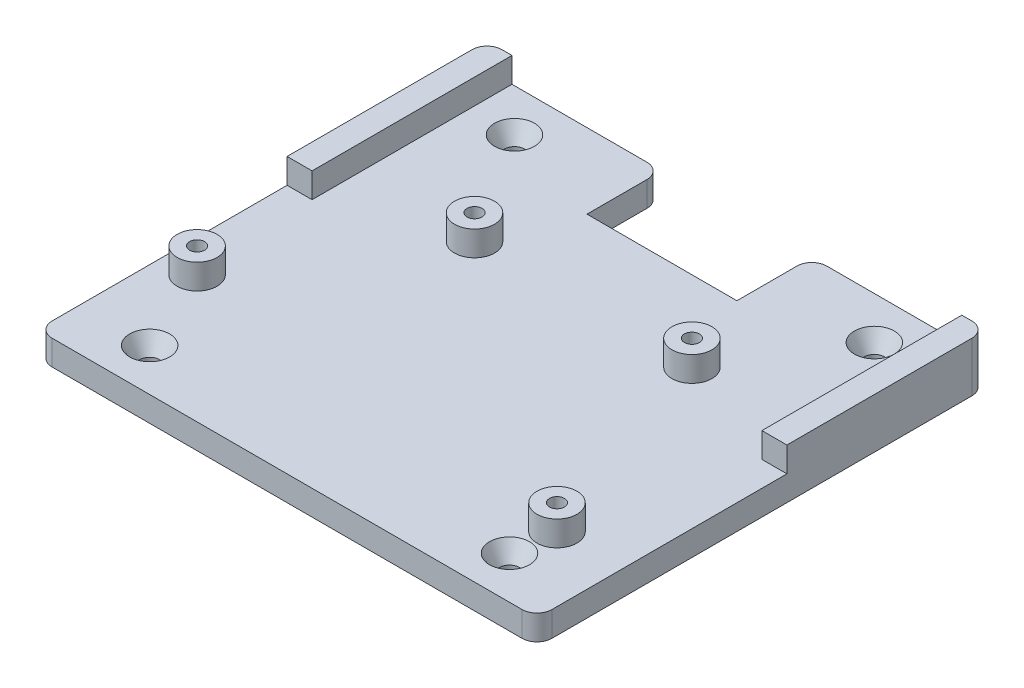
ISO-10303-21;
HEADER;
FILE_DESCRIPTION(('STEP AP214'),'2;1');
FILE_NAME('part.step','',(''),(''),'','','');
FILE_SCHEMA(('AUTOMOTIVE_DESIGN { 1 0 10303 214 1 1 1 1 }'));
ENDSEC;
DATA;
#1=APPLICATION_CONTEXT('core data for automotive mechanical design processes');
#2=APPLICATION_PROTOCOL_DEFINITION('international standard','automotive_design',2000,#1);
#3=PRODUCT_CONTEXT('',#1,'mechanical');
#4=PRODUCT('Part','Part','',(#3));
#5=PRODUCT_RELATED_PRODUCT_CATEGORY('part','',(#4));
#6=PRODUCT_DEFINITION_FORMATION('','',#4);
#7=PRODUCT_DEFINITION_CONTEXT('part definition',#1,'design');
#8=PRODUCT_DEFINITION('design','',#6,#7);
#9=PRODUCT_DEFINITION_SHAPE('','',#8);
#10=(LENGTH_UNIT() NAMED_UNIT(*) SI_UNIT(.MILLI.,.METRE.));
#11=(NAMED_UNIT(*) PLANE_ANGLE_UNIT() SI_UNIT($,.RADIAN.));
#12=(NAMED_UNIT(*) SI_UNIT($,.STERADIAN.) SOLID_ANGLE_UNIT());
#13=UNCERTAINTY_MEASURE_WITH_UNIT(LENGTH_MEASURE(1.E-05),#10,'distance_accuracy_value','');
#14=(GEOMETRIC_REPRESENTATION_CONTEXT(3) GLOBAL_UNCERTAINTY_ASSIGNED_CONTEXT((#13)) GLOBAL_UNIT_ASSIGNED_CONTEXT((#10,
#11,#12)) REPRESENTATION_CONTEXT('',''));
#15=CARTESIAN_POINT('',(0.,0.,0.));
#16=DIRECTION('',(0.,0.,1.));
#17=DIRECTION('',(1.,0.,0.));
#18=AXIS2_PLACEMENT_3D('',#15,#16,#17);
#19=CARTESIAN_POINT('',(0.,5.,0.));
#20=DIRECTION('',(0.,1.,0.));
#21=DIRECTION('',(0.,0.,1.));
#22=AXIS2_PLACEMENT_3D('',#19,#20,#21);
#23=PLANE('',#22);
#24=CARTESIAN_POINT('',(-21.5,5.,-14.));
#25=DIRECTION('',(0.,1.,0.));
#26=DIRECTION('',(0.,0.,1.));
#27=AXIS2_PLACEMENT_3D('',#24,#25,#26);
#28=CIRCLE('',#27,4.);
#29=CARTESIAN_POINT('',(-21.5,5.,-10.));
#30=VERTEX_POINT('',#29);
#31=EDGE_CURVE('E235',#30,#30,#28,.T.);
#32=ORIENTED_EDGE('',*,*,#31,.F.);
#33=EDGE_LOOP('',(#32));
#34=FACE_BOUND('',#33,.T.);
#35=CARTESIAN_POINT('',(22.,5.,-14.));
#36=DIRECTION('',(0.,1.,0.));
#37=DIRECTION('',(0.,0.,1.));
#38=AXIS2_PLACEMENT_3D('',#35,#36,#37);
#39=CIRCLE('',#38,4.);
#40=CARTESIAN_POINT('',(22.,5.,-10.));
#41=VERTEX_POINT('',#40);
#42=EDGE_CURVE('E244',#41,#41,#39,.T.);
#43=ORIENTED_EDGE('',*,*,#42,.F.);
#44=EDGE_LOOP('',(#43));
#45=FACE_BOUND('',#44,.T.);
#46=CARTESIAN_POINT('',(37.,5.,28.));
#47=DIRECTION('',(0.,1.,0.));
#48=DIRECTION('',(0.,0.,1.));
#49=AXIS2_PLACEMENT_3D('',#46,#47,#48);
#50=CIRCLE('',#49,4.);
#51=CARTESIAN_POINT('',(37.,5.,32.));
#52=VERTEX_POINT('',#51);
#53=EDGE_CURVE('E253',#52,#52,#50,.T.);
#54=ORIENTED_EDGE('',*,*,#53,.F.);
#55=EDGE_LOOP('',(#54));
#56=FACE_BOUND('',#55,.T.);
#57=CARTESIAN_POINT('',(-43.5,5.,19.5));
#58=DIRECTION('',(0.,1.,0.));
#59=DIRECTION('',(0.,0.,1.));
#60=AXIS2_PLACEMENT_3D('',#57,#58,#59);
#61=CIRCLE('',#60,4.00000000000001);
#62=CARTESIAN_POINT('',(-43.5,5.,23.5));
#63=VERTEX_POINT('',#62);
#64=EDGE_CURVE('E269',#63,#63,#61,.T.);
#65=ORIENTED_EDGE('',*,*,#64,.F.);
#66=EDGE_LOOP('',(#65));
#67=FACE_BOUND('',#66,.T.);
#68=CARTESIAN_POINT('',(-36.,5.,36.5));
#69=DIRECTION('',(0.,1.,0.));
#70=DIRECTION('',(0.,0.,1.));
#71=AXIS2_PLACEMENT_3D('',#68,#69,#70);
#72=CIRCLE('',#71,4.);
#73=CARTESIAN_POINT('',(-36.,5.,40.5));
#74=VERTEX_POINT('',#73);
#75=EDGE_CURVE('E344',#74,#74,#72,.F.);
#76=ORIENTED_EDGE('',*,*,#75,.T.);
#77=EDGE_LOOP('',(#76));
#78=FACE_BOUND('',#77,.T.);
#79=CARTESIAN_POINT('',(36.,5.,36.5));
#80=DIRECTION('',(0.,1.,0.));
#81=DIRECTION('',(0.,0.,1.));
#82=AXIS2_PLACEMENT_3D('',#79,#80,#81);
#83=CIRCLE('',#82,4.);
#84=CARTESIAN_POINT('',(36.,5.,40.5));
#85=VERTEX_POINT('',#84);
#86=EDGE_CURVE('E341',#85,#85,#83,.F.);
#87=ORIENTED_EDGE('',*,*,#86,.T.);
#88=EDGE_LOOP('',(#87));
#89=FACE_BOUND('',#88,.T.);
#90=CARTESIAN_POINT('',(36.,5.,-36.5));
#91=DIRECTION('',(0.,1.,0.));
#92=DIRECTION('',(0.,0.,1.));
#93=AXIS2_PLACEMENT_3D('',#90,#91,#92);
#94=CIRCLE('',#93,3.99999999999995);
#95=CARTESIAN_POINT('',(36.,5.,-32.5));
#96=VERTEX_POINT('',#95);
#97=EDGE_CURVE('E338',#96,#96,#94,.F.);
#98=ORIENTED_EDGE('',*,*,#97,.T.);
#99=EDGE_LOOP('',(#98));
#100=FACE_BOUND('',#99,.T.);
#101=CARTESIAN_POINT('',(-36.,5.,-36.5));
#102=DIRECTION('',(0.,1.,0.));
#103=DIRECTION('',(0.,0.,1.));
#104=AXIS2_PLACEMENT_3D('',#101,#102,#103);
#105=CIRCLE('',#104,3.99999999999995);
#106=CARTESIAN_POINT('',(-36.,5.,-32.5));
#107=VERTEX_POINT('',#106);
#108=EDGE_CURVE('E335',#107,#107,#105,.F.);
#109=ORIENTED_EDGE('',*,*,#108,.T.);
#110=EDGE_LOOP('',(#109));
#111=FACE_BOUND('',#110,.T.);
#112=DIRECTION('',(0.,0.,-1.));
#113=VECTOR('',#112,1.);
#114=CARTESIAN_POINT('',(-15.,5.,-45.));
#115=LINE('',#114,#113);
#116=CARTESIAN_POINT('',(-15.,5.,-30.));
#117=VERTEX_POINT('',#116);
#118=CARTESIAN_POINT('',(-15.,5.,-42.));
#119=VERTEX_POINT('',#118);
#120=EDGE_CURVE('E296',#117,#119,#115,.T.);
#121=ORIENTED_EDGE('',*,*,#120,.T.);
#122=CARTESIAN_POINT('',(-18.,5.,-42.));
#123=DIRECTION('',(0.,1.,0.));
#124=DIRECTION('',(0.,0.,1.));
#125=AXIS2_PLACEMENT_3D('',#122,#123,#124);
#126=CIRCLE('',#125,3.);
#127=CARTESIAN_POINT('',(-18.,5.,-45.));
#128=VERTEX_POINT('',#127);
#129=EDGE_CURVE('E388',#119,#128,#126,.T.);
#130=ORIENTED_EDGE('',*,*,#129,.T.);
#131=DIRECTION('',(-1.,0.,0.));
#132=VECTOR('',#131,1.);
#133=CARTESIAN_POINT('',(-50.,5.,-45.));
#134=LINE('',#133,#132);
#135=CARTESIAN_POINT('',(-45.,5.,-45.));
#136=VERTEX_POINT('',#135);
#137=EDGE_CURVE('E299',#128,#136,#134,.T.);
#138=ORIENTED_EDGE('',*,*,#137,.T.);
#139=DIRECTION('',(0.,0.,-1.));
#140=VECTOR('',#139,1.);
#141=CARTESIAN_POINT('',(-45.,5.,-45.));
#142=LINE('',#141,#140);
#143=CARTESIAN_POINT('',(-45.,5.,-5.));
#144=VERTEX_POINT('',#143);
#145=EDGE_CURVE('E211',#144,#136,#142,.T.);
#146=ORIENTED_EDGE('',*,*,#145,.F.);
#147=DIRECTION('',(1.,0.,0.));
#148=VECTOR('',#147,1.);
#149=CARTESIAN_POINT('',(-50.,5.,-5.));
#150=LINE('',#149,#148);
#151=CARTESIAN_POINT('',(-50.,5.,-5.));
#152=VERTEX_POINT('',#151);
#153=EDGE_CURVE('E201',#152,#144,#150,.T.);
#154=ORIENTED_EDGE('',*,*,#153,.F.);
#155=DIRECTION('',(0.,0.,1.));
#156=VECTOR('',#155,1.);
#157=CARTESIAN_POINT('',(-50.,5.,-45.));
#158=LINE('',#157,#156);
#159=CARTESIAN_POINT('',(-50.,5.,42.));
#160=VERTEX_POINT('',#159);
#161=EDGE_CURVE('E301',#152,#160,#158,.T.);
#162=ORIENTED_EDGE('',*,*,#161,.T.);
#163=CARTESIAN_POINT('',(-47.,5.,42.));
#164=DIRECTION('',(0.,1.,0.));
#165=DIRECTION('',(0.,0.,1.));
#166=AXIS2_PLACEMENT_3D('',#163,#164,#165);
#167=CIRCLE('',#166,3.);
#168=CARTESIAN_POINT('',(-47.,5.,45.));
#169=VERTEX_POINT('',#168);
#170=EDGE_CURVE('E382',#160,#169,#167,.T.);
#171=ORIENTED_EDGE('',*,*,#170,.T.);
#172=DIRECTION('',(1.,0.,0.));
#173=VECTOR('',#172,1.);
#174=CARTESIAN_POINT('',(-50.,5.,45.));
#175=LINE('',#174,#173);
#176=CARTESIAN_POINT('',(47.,5.,45.));
#177=VERTEX_POINT('',#176);
#178=EDGE_CURVE('E304',#169,#177,#175,.T.);
#179=ORIENTED_EDGE('',*,*,#178,.T.);
#180=CARTESIAN_POINT('',(47.,5.,42.));
#181=DIRECTION('',(0.,1.,0.));
#182=DIRECTION('',(0.,0.,1.));
#183=AXIS2_PLACEMENT_3D('',#180,#181,#182);
#184=CIRCLE('',#183,3.);
#185=CARTESIAN_POINT('',(50.,5.,42.));
#186=VERTEX_POINT('',#185);
#187=EDGE_CURVE('E384',#177,#186,#184,.T.);
#188=ORIENTED_EDGE('',*,*,#187,.T.);
#189=DIRECTION('',(0.,0.,-1.));
#190=VECTOR('',#189,1.);
#191=CARTESIAN_POINT('',(50.,5.,-45.));
#192=LINE('',#191,#190);
#193=CARTESIAN_POINT('',(50.,5.,-5.00000000000001));
#194=VERTEX_POINT('',#193);
#195=EDGE_CURVE('E286',#186,#194,#192,.T.);
#196=ORIENTED_EDGE('',*,*,#195,.T.);
#197=DIRECTION('',(1.,0.,0.));
#198=VECTOR('',#197,1.);
#199=CARTESIAN_POINT('',(50.,5.,-5.));
#200=LINE('',#199,#198);
#201=CARTESIAN_POINT('',(45.,5.,-5.));
#202=VERTEX_POINT('',#201);
#203=EDGE_CURVE('E185',#202,#194,#200,.T.);
#204=ORIENTED_EDGE('',*,*,#203,.F.);
#205=DIRECTION('',(0.,0.,1.));
#206=VECTOR('',#205,1.);
#207=CARTESIAN_POINT('',(45.,5.,-45.));
#208=LINE('',#207,#206);
#209=CARTESIAN_POINT('',(45.,5.,-45.));
#210=VERTEX_POINT('',#209);
#211=EDGE_CURVE('E182',#210,#202,#208,.T.);
#212=ORIENTED_EDGE('',*,*,#211,.F.);
#213=DIRECTION('',(-1.,0.,0.));
#214=VECTOR('',#213,1.);
#215=CARTESIAN_POINT('',(15.,5.,-45.));
#216=LINE('',#215,#214);
#217=CARTESIAN_POINT('',(18.,5.,-45.));
#218=VERTEX_POINT('',#217);
#219=EDGE_CURVE('E288',#210,#218,#216,.T.);
#220=ORIENTED_EDGE('',*,*,#219,.T.);
#221=CARTESIAN_POINT('',(18.,5.,-42.));
#222=DIRECTION('',(0.,1.,0.));
#223=DIRECTION('',(0.,0.,1.));
#224=AXIS2_PLACEMENT_3D('',#221,#222,#223);
#225=CIRCLE('',#224,3.);
#226=CARTESIAN_POINT('',(15.,5.,-42.));
#227=VERTEX_POINT('',#226);
#228=EDGE_CURVE('E386',#218,#227,#225,.T.);
#229=ORIENTED_EDGE('',*,*,#228,.T.);
#230=DIRECTION('',(0.,0.,1.));
#231=VECTOR('',#230,1.);
#232=CARTESIAN_POINT('',(15.,5.,-30.));
#233=LINE('',#232,#231);
#234=CARTESIAN_POINT('',(15.,5.,-30.));
#235=VERTEX_POINT('',#234);
#236=EDGE_CURVE('E292',#227,#235,#233,.T.);
#237=ORIENTED_EDGE('',*,*,#236,.T.);
#238=DIRECTION('',(-1.,0.,0.));
#239=VECTOR('',#238,1.);
#240=CARTESIAN_POINT('',(-15.,5.,-30.));
#241=LINE('',#240,#239);
#242=EDGE_CURVE('E294',#235,#117,#241,.T.);
#243=ORIENTED_EDGE('',*,*,#242,.T.);
#244=EDGE_LOOP('',(#121,#130,#138,#146,#154,#162,#171,#179,#188,#196,#204,#212,#220,#229,#237,#243));
#245=FACE_BOUND('',#244,.T.);
#246=ADVANCED_FACE('F35',(#34,#45,#56,#67,#78,#89,#100,#111,#245),#23,.T.);
#247=CARTESIAN_POINT('',(0.,0.,0.));
#248=DIRECTION('',(0.,1.,0.));
#249=DIRECTION('',(0.,0.,1.));
#250=AXIS2_PLACEMENT_3D('',#247,#248,#249);
#251=PLANE('',#250);
#252=DIRECTION('',(-1.,0.,0.));
#253=VECTOR('',#252,1.);
#254=CARTESIAN_POINT('',(-50.,0.,-45.));
#255=LINE('',#254,#253);
#256=CARTESIAN_POINT('',(-18.,0.,-45.));
#257=VERTEX_POINT('',#256);
#258=CARTESIAN_POINT('',(-47.,0.,-45.));
#259=VERTEX_POINT('',#258);
#260=EDGE_CURVE('E319',#257,#259,#255,.T.);
#261=ORIENTED_EDGE('',*,*,#260,.F.);
#262=CARTESIAN_POINT('',(-18.,0.,-42.));
#263=DIRECTION('',(0.,1.,0.));
#264=DIRECTION('',(0.,0.,1.));
#265=AXIS2_PLACEMENT_3D('',#262,#263,#264);
#266=CIRCLE('',#265,3.);
#267=CARTESIAN_POINT('',(-15.,0.,-42.));
#268=VERTEX_POINT('',#267);
#269=EDGE_CURVE('E378',#257,#268,#266,.F.);
#270=ORIENTED_EDGE('',*,*,#269,.T.);
#271=DIRECTION('',(0.,0.,-1.));
#272=VECTOR('',#271,1.);
#273=CARTESIAN_POINT('',(-15.,0.,-45.));
#274=LINE('',#273,#272);
#275=CARTESIAN_POINT('',(-15.,0.,-30.));
#276=VERTEX_POINT('',#275);
#277=EDGE_CURVE('E316',#276,#268,#274,.T.);
#278=ORIENTED_EDGE('',*,*,#277,.F.);
#279=DIRECTION('',(-1.,0.,0.));
#280=VECTOR('',#279,1.);
#281=CARTESIAN_POINT('',(-15.,0.,-30.));
#282=LINE('',#281,#280);
#283=CARTESIAN_POINT('',(15.,0.,-30.));
#284=VERTEX_POINT('',#283);
#285=EDGE_CURVE('E314',#284,#276,#282,.T.);
#286=ORIENTED_EDGE('',*,*,#285,.F.);
#287=DIRECTION('',(0.,0.,1.));
#288=VECTOR('',#287,1.);
#289=CARTESIAN_POINT('',(15.,0.,-30.));
#290=LINE('',#289,#288);
#291=CARTESIAN_POINT('',(15.,0.,-42.));
#292=VERTEX_POINT('',#291);
#293=EDGE_CURVE('E312',#292,#284,#290,.T.);
#294=ORIENTED_EDGE('',*,*,#293,.F.);
#295=CARTESIAN_POINT('',(18.,0.,-42.));
#296=DIRECTION('',(0.,1.,0.));
#297=DIRECTION('',(0.,0.,1.));
#298=AXIS2_PLACEMENT_3D('',#295,#296,#297);
#299=CIRCLE('',#298,3.);
#300=CARTESIAN_POINT('',(18.,0.,-45.));
#301=VERTEX_POINT('',#300);
#302=EDGE_CURVE('E376',#292,#301,#299,.F.);
#303=ORIENTED_EDGE('',*,*,#302,.T.);
#304=DIRECTION('',(-1.,0.,0.));
#305=VECTOR('',#304,1.);
#306=CARTESIAN_POINT('',(15.,0.,-45.));
#307=LINE('',#306,#305);
#308=CARTESIAN_POINT('',(47.,0.,-45.));
#309=VERTEX_POINT('',#308);
#310=EDGE_CURVE('E309',#309,#301,#307,.T.);
#311=ORIENTED_EDGE('',*,*,#310,.F.);
#312=CARTESIAN_POINT('',(47.,0.,-42.));
#313=DIRECTION('',(0.,1.,0.));
#314=DIRECTION('',(0.,0.,1.));
#315=AXIS2_PLACEMENT_3D('',#312,#313,#314);
#316=CIRCLE('',#315,3.);
#317=CARTESIAN_POINT('',(50.,0.,-42.));
#318=VERTEX_POINT('',#317);
#319=EDGE_CURVE('E372',#309,#318,#316,.F.);
#320=ORIENTED_EDGE('',*,*,#319,.T.);
#321=DIRECTION('',(0.,0.,-1.));
#322=VECTOR('',#321,1.);
#323=CARTESIAN_POINT('',(50.,0.,-45.));
#324=LINE('',#323,#322);
#325=CARTESIAN_POINT('',(50.,0.,42.));
#326=VERTEX_POINT('',#325);
#327=EDGE_CURVE('E285',#326,#318,#324,.T.);
#328=ORIENTED_EDGE('',*,*,#327,.F.);
#329=CARTESIAN_POINT('',(47.,0.,42.));
#330=DIRECTION('',(0.,1.,0.));
#331=DIRECTION('',(0.,0.,1.));
#332=AXIS2_PLACEMENT_3D('',#329,#330,#331);
#333=CIRCLE('',#332,3.);
#334=CARTESIAN_POINT('',(47.,0.,45.));
#335=VERTEX_POINT('',#334);
#336=EDGE_CURVE('E374',#326,#335,#333,.F.);
#337=ORIENTED_EDGE('',*,*,#336,.T.);
#338=DIRECTION('',(1.,0.,0.));
#339=VECTOR('',#338,1.);
#340=CARTESIAN_POINT('',(-50.,0.,45.));
#341=LINE('',#340,#339);
#342=CARTESIAN_POINT('',(-47.,0.,45.));
#343=VERTEX_POINT('',#342);
#344=EDGE_CURVE('E289',#343,#335,#341,.T.);
#345=ORIENTED_EDGE('',*,*,#344,.F.);
#346=CARTESIAN_POINT('',(-47.,0.,42.));
#347=DIRECTION('',(0.,1.,0.));
#348=DIRECTION('',(0.,0.,1.));
#349=AXIS2_PLACEMENT_3D('',#346,#347,#348);
#350=CIRCLE('',#349,3.);
#351=CARTESIAN_POINT('',(-50.,0.,42.));
#352=VERTEX_POINT('',#351);
#353=EDGE_CURVE('E368',#343,#352,#350,.F.);
#354=ORIENTED_EDGE('',*,*,#353,.T.);
#355=DIRECTION('',(0.,0.,1.));
#356=VECTOR('',#355,1.);
#357=CARTESIAN_POINT('',(-50.,0.,-45.));
#358=LINE('',#357,#356);
#359=CARTESIAN_POINT('',(-50.,0.,-42.));
#360=VERTEX_POINT('',#359);
#361=EDGE_CURVE('E322',#360,#352,#358,.T.);
#362=ORIENTED_EDGE('',*,*,#361,.F.);
#363=CARTESIAN_POINT('',(-47.,0.,-42.));
#364=DIRECTION('',(0.,1.,0.));
#365=DIRECTION('',(0.,0.,1.));
#366=AXIS2_PLACEMENT_3D('',#363,#364,#365);
#367=CIRCLE('',#366,3.);
#368=EDGE_CURVE('E370',#360,#259,#367,.F.);
#369=ORIENTED_EDGE('',*,*,#368,.T.);
#370=EDGE_LOOP('',(#261,#270,#278,#286,#294,#303,#311,#320,#328,#337,#345,#354,#362,#369));
#371=FACE_BOUND('',#370,.T.);
#372=CARTESIAN_POINT('',(-36.,0.,36.5));
#373=DIRECTION('',(0.,1.,0.));
#374=DIRECTION('',(0.,0.,1.));
#375=AXIS2_PLACEMENT_3D('',#372,#373,#374);
#376=CIRCLE('',#375,2.);
#377=CARTESIAN_POINT('',(-36.,0.,38.5));
#378=VERTEX_POINT('',#377);
#379=EDGE_CURVE('E282',#378,#378,#376,.T.);
#380=ORIENTED_EDGE('',*,*,#379,.T.);
#381=EDGE_LOOP('',(#380));
#382=FACE_BOUND('',#381,.T.);
#383=CARTESIAN_POINT('',(-36.,0.,-36.5));
#384=DIRECTION('',(0.,1.,0.));
#385=DIRECTION('',(0.,0.,1.));
#386=AXIS2_PLACEMENT_3D('',#383,#384,#385);
#387=CIRCLE('',#386,2.);
#388=CARTESIAN_POINT('',(-36.,0.,-34.5));
#389=VERTEX_POINT('',#388);
#390=EDGE_CURVE('E279',#389,#389,#387,.T.);
#391=ORIENTED_EDGE('',*,*,#390,.T.);
#392=EDGE_LOOP('',(#391));
#393=FACE_BOUND('',#392,.T.);
#394=CARTESIAN_POINT('',(36.,0.,-36.5));
#395=DIRECTION('',(0.,1.,0.));
#396=DIRECTION('',(0.,0.,1.));
#397=AXIS2_PLACEMENT_3D('',#394,#395,#396);
#398=CIRCLE('',#397,2.);
#399=CARTESIAN_POINT('',(36.,0.,-34.5));
#400=VERTEX_POINT('',#399);
#401=EDGE_CURVE('E276',#400,#400,#398,.T.);
#402=ORIENTED_EDGE('',*,*,#401,.T.);
#403=EDGE_LOOP('',(#402));
#404=FACE_BOUND('',#403,.T.);
#405=CARTESIAN_POINT('',(36.,0.,36.5));
#406=DIRECTION('',(0.,1.,0.));
#407=DIRECTION('',(0.,0.,1.));
#408=AXIS2_PLACEMENT_3D('',#405,#406,#407);
#409=CIRCLE('',#408,2.);
#410=CARTESIAN_POINT('',(36.,0.,38.5));
#411=VERTEX_POINT('',#410);
#412=EDGE_CURVE('E268',#411,#411,#409,.T.);
#413=ORIENTED_EDGE('',*,*,#412,.T.);
#414=EDGE_LOOP('',(#413));
#415=FACE_BOUND('',#414,.T.);
#416=ADVANCED_FACE('F420',(#371,#382,#393,#404,#415),#251,.F.);
#417=CARTESIAN_POINT('',(50.,5.,-45.));
#418=DIRECTION('',(-1.,0.,0.));
#419=DIRECTION('',(0.,0.,1.));
#420=AXIS2_PLACEMENT_3D('',#417,#418,#419);
#421=PLANE('',#420);
#422=ORIENTED_EDGE('',*,*,#195,.F.);
#423=DIRECTION('',(0.,-1.,0.));
#424=VECTOR('',#423,1.);
#425=CARTESIAN_POINT('',(50.,5.,42.));
#426=LINE('',#425,#424);
#427=EDGE_CURVE('E399',#186,#326,#426,.T.);
#428=ORIENTED_EDGE('',*,*,#427,.T.);
#429=ORIENTED_EDGE('',*,*,#327,.T.);
#430=DIRECTION('',(0.,-1.,0.));
#431=VECTOR('',#430,1.);
#432=CARTESIAN_POINT('',(50.,5.,-42.));
#433=LINE('',#432,#431);
#434=CARTESIAN_POINT('',(50.,10.,-42.));
#435=VERTEX_POINT('',#434);
#436=EDGE_CURVE('E56',#318,#435,#433,.F.);
#437=ORIENTED_EDGE('',*,*,#436,.T.);
#438=DIRECTION('',(0.,0.,-1.));
#439=VECTOR('',#438,1.);
#440=CARTESIAN_POINT('',(50.,10.,-45.));
#441=LINE('',#440,#439);
#442=CARTESIAN_POINT('',(50.,10.,-5.));
#443=VERTEX_POINT('',#442);
#444=EDGE_CURVE('E193',#443,#435,#441,.T.);
#445=ORIENTED_EDGE('',*,*,#444,.F.);
#446=DIRECTION('',(0.,-1.,0.));
#447=VECTOR('',#446,1.);
#448=CARTESIAN_POINT('',(50.,50.3112887414927,-5.));
#449=LINE('',#448,#447);
#450=EDGE_CURVE('E191',#443,#194,#449,.T.);
#451=ORIENTED_EDGE('',*,*,#450,.T.);
#452=EDGE_LOOP('',(#422,#428,#429,#437,#445,#451));
#453=FACE_BOUND('',#452,.T.);
#454=ADVANCED_FACE('F437',(#453),#421,.F.);
#455=CARTESIAN_POINT('',(15.,5.,-45.));
#456=DIRECTION('',(0.,0.,1.));
#457=DIRECTION('',(1.,0.,0.));
#458=AXIS2_PLACEMENT_3D('',#455,#456,#457);
#459=PLANE('',#458);
#460=ORIENTED_EDGE('',*,*,#310,.T.);
#461=DIRECTION('',(0.,-1.,0.));
#462=VECTOR('',#461,1.);
#463=CARTESIAN_POINT('',(18.,5.,-45.));
#464=LINE('',#463,#462);
#465=EDGE_CURVE('E396',#301,#218,#464,.F.);
#466=ORIENTED_EDGE('',*,*,#465,.T.);
#467=ORIENTED_EDGE('',*,*,#219,.F.);
#468=DIRECTION('',(0.,-1.,0.));
#469=VECTOR('',#468,1.);
#470=CARTESIAN_POINT('',(45.,50.3112887414927,-45.));
#471=LINE('',#470,#469);
#472=CARTESIAN_POINT('',(45.,10.,-45.));
#473=VERTEX_POINT('',#472);
#474=EDGE_CURVE('E208',#473,#210,#471,.T.);
#475=ORIENTED_EDGE('',*,*,#474,.F.);
#476=DIRECTION('',(-1.,0.,0.));
#477=VECTOR('',#476,1.);
#478=CARTESIAN_POINT('',(50.,10.,-45.));
#479=LINE('',#478,#477);
#480=CARTESIAN_POINT('',(47.,10.,-45.));
#481=VERTEX_POINT('',#480);
#482=EDGE_CURVE('E197',#481,#473,#479,.T.);
#483=ORIENTED_EDGE('',*,*,#482,.F.);
#484=DIRECTION('',(0.,-1.,0.));
#485=VECTOR('',#484,1.);
#486=CARTESIAN_POINT('',(47.,5.,-45.));
#487=LINE('',#486,#485);
#488=EDGE_CURVE('E393',#481,#309,#487,.T.);
#489=ORIENTED_EDGE('',*,*,#488,.T.);
#490=EDGE_LOOP('',(#460,#466,#467,#475,#483,#489));
#491=FACE_BOUND('',#490,.T.);
#492=ADVANCED_FACE('F444',(#491),#459,.F.);
#493=CARTESIAN_POINT('',(15.,5.,-30.));
#494=DIRECTION('',(1.,0.,0.));
#495=DIRECTION('',(0.,0.,-1.));
#496=AXIS2_PLACEMENT_3D('',#493,#494,#495);
#497=PLANE('',#496);
#498=ORIENTED_EDGE('',*,*,#236,.F.);
#499=DIRECTION('',(0.,-1.,0.));
#500=VECTOR('',#499,1.);
#501=CARTESIAN_POINT('',(15.,5.,-42.));
#502=LINE('',#501,#500);
#503=EDGE_CURVE('E390',#227,#292,#502,.T.);
#504=ORIENTED_EDGE('',*,*,#503,.T.);
#505=ORIENTED_EDGE('',*,*,#293,.T.);
#506=DIRECTION('',(0.,-1.,0.));
#507=VECTOR('',#506,1.);
#508=CARTESIAN_POINT('',(15.,5.,-30.));
#509=LINE('',#508,#507);
#510=EDGE_CURVE('E329',#235,#284,#509,.T.);
#511=ORIENTED_EDGE('',*,*,#510,.F.);
#512=EDGE_LOOP('',(#498,#504,#505,#511));
#513=FACE_BOUND('',#512,.T.);
#514=ADVANCED_FACE('F453',(#513),#497,.F.);
#515=CARTESIAN_POINT('',(-15.,5.,-30.));
#516=DIRECTION('',(0.,0.,1.));
#517=DIRECTION('',(1.,0.,0.));
#518=AXIS2_PLACEMENT_3D('',#515,#516,#517);
#519=PLANE('',#518);
#520=ORIENTED_EDGE('',*,*,#285,.T.);
#521=DIRECTION('',(0.,-1.,0.));
#522=VECTOR('',#521,1.);
#523=CARTESIAN_POINT('',(-15.,5.,-30.));
#524=LINE('',#523,#522);
#525=EDGE_CURVE('E307',#117,#276,#524,.T.);
#526=ORIENTED_EDGE('',*,*,#525,.F.);
#527=ORIENTED_EDGE('',*,*,#242,.F.);
#528=ORIENTED_EDGE('',*,*,#510,.T.);
#529=EDGE_LOOP('',(#520,#526,#527,#528));
#530=FACE_BOUND('',#529,.T.);
#531=ADVANCED_FACE('F459',(#530),#519,.F.);
#532=CARTESIAN_POINT('',(-15.,5.,-45.));
#533=DIRECTION('',(-1.,0.,0.));
#534=DIRECTION('',(0.,0.,1.));
#535=AXIS2_PLACEMENT_3D('',#532,#533,#534);
#536=PLANE('',#535);
#537=ORIENTED_EDGE('',*,*,#277,.T.);
#538=DIRECTION('',(0.,-1.,0.));
#539=VECTOR('',#538,1.);
#540=CARTESIAN_POINT('',(-15.,5.,-42.));
#541=LINE('',#540,#539);
#542=EDGE_CURVE('E380',#268,#119,#541,.F.);
#543=ORIENTED_EDGE('',*,*,#542,.T.);
#544=ORIENTED_EDGE('',*,*,#120,.F.);
#545=ORIENTED_EDGE('',*,*,#525,.T.);
#546=EDGE_LOOP('',(#537,#543,#544,#545));
#547=FACE_BOUND('',#546,.T.);
#548=ADVANCED_FACE('F463',(#547),#536,.F.);
#549=CARTESIAN_POINT('',(-50.,5.,-45.));
#550=DIRECTION('',(0.,0.,1.));
#551=DIRECTION('',(1.,0.,0.));
#552=AXIS2_PLACEMENT_3D('',#549,#550,#551);
#553=PLANE('',#552);
#554=ORIENTED_EDGE('',*,*,#137,.F.);
#555=DIRECTION('',(0.,-1.,0.));
#556=VECTOR('',#555,1.);
#557=CARTESIAN_POINT('',(-18.,5.,-45.));
#558=LINE('',#557,#556);
#559=EDGE_CURVE('E365',#128,#257,#558,.T.);
#560=ORIENTED_EDGE('',*,*,#559,.T.);
#561=ORIENTED_EDGE('',*,*,#260,.T.);
#562=DIRECTION('',(0.,-1.,0.));
#563=VECTOR('',#562,1.);
#564=CARTESIAN_POINT('',(-47.,5.,-45.));
#565=LINE('',#564,#563);
#566=CARTESIAN_POINT('',(-47.,10.,-45.));
#567=VERTEX_POINT('',#566);
#568=EDGE_CURVE('E363',#259,#567,#565,.F.);
#569=ORIENTED_EDGE('',*,*,#568,.T.);
#570=DIRECTION('',(-1.,0.,0.));
#571=VECTOR('',#570,1.);
#572=CARTESIAN_POINT('',(-50.,10.,-45.));
#573=LINE('',#572,#571);
#574=CARTESIAN_POINT('',(-45.,10.,-45.));
#575=VERTEX_POINT('',#574);
#576=EDGE_CURVE('E227',#575,#567,#573,.T.);
#577=ORIENTED_EDGE('',*,*,#576,.F.);
#578=DIRECTION('',(0.,-1.,0.));
#579=VECTOR('',#578,1.);
#580=CARTESIAN_POINT('',(-45.,50.3112887414927,-45.));
#581=LINE('',#580,#579);
#582=EDGE_CURVE('E214',#575,#136,#581,.T.);
#583=ORIENTED_EDGE('',*,*,#582,.T.);
#584=EDGE_LOOP('',(#554,#560,#561,#569,#577,#583));
#585=FACE_BOUND('',#584,.T.);
#586=ADVANCED_FACE('F471',(#585),#553,.F.);
#587=CARTESIAN_POINT('',(-50.,5.,-45.));
#588=DIRECTION('',(1.,0.,0.));
#589=DIRECTION('',(0.,0.,-1.));
#590=AXIS2_PLACEMENT_3D('',#587,#588,#589);
#591=PLANE('',#590);
#592=DIRECTION('',(0.,0.,1.));
#593=VECTOR('',#592,1.);
#594=CARTESIAN_POINT('',(-50.,10.,-45.));
#595=LINE('',#594,#593);
#596=CARTESIAN_POINT('',(-50.,10.,-42.));
#597=VERTEX_POINT('',#596);
#598=CARTESIAN_POINT('',(-50.,10.,-5.));
#599=VERTEX_POINT('',#598);
#600=EDGE_CURVE('E225',#597,#599,#595,.T.);
#601=ORIENTED_EDGE('',*,*,#600,.F.);
#602=DIRECTION('',(0.,-1.,0.));
#603=VECTOR('',#602,1.);
#604=CARTESIAN_POINT('',(-50.,5.,-42.));
#605=LINE('',#604,#603);
#606=EDGE_CURVE('E43',#597,#360,#605,.T.);
#607=ORIENTED_EDGE('',*,*,#606,.T.);
#608=ORIENTED_EDGE('',*,*,#361,.T.);
#609=DIRECTION('',(0.,-1.,0.));
#610=VECTOR('',#609,1.);
#611=CARTESIAN_POINT('',(-50.,5.,42.));
#612=LINE('',#611,#610);
#613=EDGE_CURVE('E409',#352,#160,#612,.F.);
#614=ORIENTED_EDGE('',*,*,#613,.T.);
#615=ORIENTED_EDGE('',*,*,#161,.F.);
#616=DIRECTION('',(0.,-1.,0.));
#617=VECTOR('',#616,1.);
#618=CARTESIAN_POINT('',(-50.,50.3112887414927,-5.));
#619=LINE('',#618,#617);
#620=EDGE_CURVE('E198',#599,#152,#619,.T.);
#621=ORIENTED_EDGE('',*,*,#620,.F.);
#622=EDGE_LOOP('',(#601,#607,#608,#614,#615,#621));
#623=FACE_BOUND('',#622,.T.);
#624=ADVANCED_FACE('F414',(#623),#591,.F.);
#625=CARTESIAN_POINT('',(-50.,5.,45.));
#626=DIRECTION('',(0.,0.,-1.));
#627=DIRECTION('',(-1.,0.,0.));
#628=AXIS2_PLACEMENT_3D('',#625,#626,#627);
#629=PLANE('',#628);
#630=ORIENTED_EDGE('',*,*,#344,.T.);
#631=DIRECTION('',(0.,-1.,0.));
#632=VECTOR('',#631,1.);
#633=CARTESIAN_POINT('',(47.,5.,45.));
#634=LINE('',#633,#632);
#635=EDGE_CURVE('E405',#335,#177,#634,.F.);
#636=ORIENTED_EDGE('',*,*,#635,.T.);
#637=ORIENTED_EDGE('',*,*,#178,.F.);
#638=DIRECTION('',(0.,-1.,0.));
#639=VECTOR('',#638,1.);
#640=CARTESIAN_POINT('',(-47.,5.,45.));
#641=LINE('',#640,#639);
#642=EDGE_CURVE('E402',#169,#343,#641,.T.);
#643=ORIENTED_EDGE('',*,*,#642,.T.);
#644=EDGE_LOOP('',(#630,#636,#637,#643));
#645=FACE_BOUND('',#644,.T.);
#646=ADVANCED_FACE('F428',(#645),#629,.F.);
#647=CARTESIAN_POINT('',(-36.,5.,36.5));
#648=DIRECTION('',(0.,-1.,0.));
#649=DIRECTION('',(0.,0.,-1.));
#650=AXIS2_PLACEMENT_3D('',#647,#648,#649);
#651=CYLINDRICAL_SURFACE('',#650,2.);
#652=CARTESIAN_POINT('',(-36.,1.53589838486224,36.5));
#653=DIRECTION('',(0.,1.,0.));
#654=DIRECTION('',(0.,0.,1.));
#655=AXIS2_PLACEMENT_3D('',#652,#653,#654);
#656=CIRCLE('',#655,2.);
#657=CARTESIAN_POINT('',(-36.,1.53589838486224,38.5));
#658=VERTEX_POINT('',#657);
#659=EDGE_CURVE('E332',#658,#658,#656,.T.);
#660=ORIENTED_EDGE('',*,*,#659,.T.);
#661=EDGE_LOOP('',(#660));
#662=FACE_BOUND('',#661,.T.);
#663=ORIENTED_EDGE('',*,*,#379,.F.);
#664=EDGE_LOOP('',(#663));
#665=FACE_BOUND('',#664,.T.);
#666=ADVANCED_FACE('F578',(#662,#665),#651,.F.);
#667=CARTESIAN_POINT('',(-36.,5.,-36.5));
#668=DIRECTION('',(0.,-1.,0.));
#669=DIRECTION('',(0.,0.,-1.));
#670=AXIS2_PLACEMENT_3D('',#667,#668,#669);
#671=CYLINDRICAL_SURFACE('',#670,2.);
#672=CARTESIAN_POINT('',(-36.,1.53589838486233,-36.5));
#673=DIRECTION('',(0.,1.,0.));
#674=DIRECTION('',(0.,0.,1.));
#675=AXIS2_PLACEMENT_3D('',#672,#673,#674);
#676=CIRCLE('',#675,2.);
#677=CARTESIAN_POINT('',(-36.,1.53589838486233,-34.5));
#678=VERTEX_POINT('',#677);
#679=EDGE_CURVE('E273',#678,#678,#676,.T.);
#680=ORIENTED_EDGE('',*,*,#679,.T.);
#681=EDGE_LOOP('',(#680));
#682=FACE_BOUND('',#681,.T.);
#683=ORIENTED_EDGE('',*,*,#390,.F.);
#684=EDGE_LOOP('',(#683));
#685=FACE_BOUND('',#684,.T.);
#686=ADVANCED_FACE('F575',(#682,#685),#671,.F.);
#687=CARTESIAN_POINT('',(36.,5.,-36.5));
#688=DIRECTION('',(0.,-1.,0.));
#689=DIRECTION('',(0.,0.,-1.));
#690=AXIS2_PLACEMENT_3D('',#687,#688,#689);
#691=CYLINDRICAL_SURFACE('',#690,2.);
#692=CARTESIAN_POINT('',(36.,1.53589838486233,-36.5));
#693=DIRECTION('',(0.,1.,0.));
#694=DIRECTION('',(0.,0.,1.));
#695=AXIS2_PLACEMENT_3D('',#692,#693,#694);
#696=CIRCLE('',#695,2.);
#697=CARTESIAN_POINT('',(36.,1.53589838486233,-34.5));
#698=VERTEX_POINT('',#697);
#699=EDGE_CURVE('E350',#698,#698,#696,.T.);
#700=ORIENTED_EDGE('',*,*,#699,.T.);
#701=EDGE_LOOP('',(#700));
#702=FACE_BOUND('',#701,.T.);
#703=ORIENTED_EDGE('',*,*,#401,.F.);
#704=EDGE_LOOP('',(#703));
#705=FACE_BOUND('',#704,.T.);
#706=ADVANCED_FACE('F571',(#702,#705),#691,.F.);
#707=CARTESIAN_POINT('',(36.,5.,36.5));
#708=DIRECTION('',(0.,-1.,0.));
#709=DIRECTION('',(0.,0.,-1.));
#710=AXIS2_PLACEMENT_3D('',#707,#708,#709);
#711=CYLINDRICAL_SURFACE('',#710,2.);
#712=CARTESIAN_POINT('',(36.,1.53589838486224,36.5));
#713=DIRECTION('',(0.,1.,0.));
#714=DIRECTION('',(0.,0.,1.));
#715=AXIS2_PLACEMENT_3D('',#712,#713,#714);
#716=CIRCLE('',#715,2.);
#717=CARTESIAN_POINT('',(36.,1.53589838486224,38.5));
#718=VERTEX_POINT('',#717);
#719=EDGE_CURVE('E347',#718,#718,#716,.T.);
#720=ORIENTED_EDGE('',*,*,#719,.T.);
#721=EDGE_LOOP('',(#720));
#722=FACE_BOUND('',#721,.T.);
#723=ORIENTED_EDGE('',*,*,#412,.F.);
#724=EDGE_LOOP('',(#723));
#725=FACE_BOUND('',#724,.T.);
#726=ADVANCED_FACE('F567',(#722,#725),#711,.F.);
#727=CARTESIAN_POINT('',(-36.,1.53589838486224,36.5));
#728=DIRECTION('',(0.,1.,0.));
#729=DIRECTION('',(0.,0.,1.));
#730=AXIS2_PLACEMENT_3D('',#727,#728,#729);
#731=CONICAL_SURFACE('',#730,2.,0.523598775598298);
#732=ORIENTED_EDGE('',*,*,#75,.F.);
#733=EDGE_LOOP('',(#732));
#734=FACE_BOUND('',#733,.T.);
#735=ORIENTED_EDGE('',*,*,#659,.F.);
#736=EDGE_LOOP('',(#735));
#737=FACE_BOUND('',#736,.T.);
#738=ADVANCED_FACE('F570',(#734,#737),#731,.F.);
#739=CARTESIAN_POINT('',(36.,1.53589838486224,36.5));
#740=DIRECTION('',(0.,1.,0.));
#741=DIRECTION('',(0.,0.,1.));
#742=AXIS2_PLACEMENT_3D('',#739,#740,#741);
#743=CONICAL_SURFACE('',#742,2.,0.523598775598298);
#744=ORIENTED_EDGE('',*,*,#86,.F.);
#745=EDGE_LOOP('',(#744));
#746=FACE_BOUND('',#745,.T.);
#747=ORIENTED_EDGE('',*,*,#719,.F.);
#748=EDGE_LOOP('',(#747));
#749=FACE_BOUND('',#748,.T.);
#750=ADVANCED_FACE('F600',(#746,#749),#743,.F.);
#751=CARTESIAN_POINT('',(36.,1.53589838486233,-36.5));
#752=DIRECTION('',(0.,1.,0.));
#753=DIRECTION('',(0.,0.,1.));
#754=AXIS2_PLACEMENT_3D('',#751,#752,#753);
#755=CONICAL_SURFACE('',#754,2.,0.523598775598298);
#756=ORIENTED_EDGE('',*,*,#97,.F.);
#757=EDGE_LOOP('',(#756));
#758=FACE_BOUND('',#757,.T.);
#759=ORIENTED_EDGE('',*,*,#699,.F.);
#760=EDGE_LOOP('',(#759));
#761=FACE_BOUND('',#760,.T.);
#762=ADVANCED_FACE('F606',(#758,#761),#755,.F.);
#763=CARTESIAN_POINT('',(-36.,1.53589838486233,-36.5));
#764=DIRECTION('',(0.,1.,0.));
#765=DIRECTION('',(0.,0.,1.));
#766=AXIS2_PLACEMENT_3D('',#763,#764,#765);
#767=CONICAL_SURFACE('',#766,2.,0.523598775598298);
#768=ORIENTED_EDGE('',*,*,#108,.F.);
#769=EDGE_LOOP('',(#768));
#770=FACE_BOUND('',#769,.T.);
#771=ORIENTED_EDGE('',*,*,#679,.F.);
#772=EDGE_LOOP('',(#771));
#773=FACE_BOUND('',#772,.T.);
#774=ADVANCED_FACE('F562',(#770,#773),#767,.F.);
#775=CARTESIAN_POINT('',(-43.5,10.,19.5));
#776=DIRECTION('',(0.,1.,0.));
#777=DIRECTION('',(0.,0.,1.));
#778=AXIS2_PLACEMENT_3D('',#775,#776,#777);
#779=PLANE('',#778);
#780=CARTESIAN_POINT('',(-43.5,10.,19.5));
#781=DIRECTION('',(0.,1.,0.));
#782=DIRECTION('',(0.,0.,1.));
#783=AXIS2_PLACEMENT_3D('',#780,#781,#782);
#784=CIRCLE('',#783,4.00000000000001);
#785=CARTESIAN_POINT('',(-43.5,10.,23.5));
#786=VERTEX_POINT('',#785);
#787=EDGE_CURVE('E263',#786,#786,#784,.T.);
#788=ORIENTED_EDGE('',*,*,#787,.T.);
#789=EDGE_LOOP('',(#788));
#790=FACE_BOUND('',#789,.T.);
#791=CARTESIAN_POINT('',(-43.5,10.,19.5));
#792=DIRECTION('',(0.,1.,0.));
#793=DIRECTION('',(0.,0.,1.));
#794=AXIS2_PLACEMENT_3D('',#791,#792,#793);
#795=CIRCLE('',#794,1.5);
#796=CARTESIAN_POINT('',(-43.5,10.,21.));
#797=VERTEX_POINT('',#796);
#798=EDGE_CURVE('E260',#797,#797,#795,.T.);
#799=ORIENTED_EDGE('',*,*,#798,.F.);
#800=EDGE_LOOP('',(#799));
#801=FACE_BOUND('',#800,.T.);
#802=ADVANCED_FACE('F559',(#790,#801),#779,.T.);
#803=CARTESIAN_POINT('',(-43.5,10.,19.5));
#804=DIRECTION('',(0.,-1.,0.));
#805=DIRECTION('',(0.,0.,-1.));
#806=AXIS2_PLACEMENT_3D('',#803,#804,#805);
#807=CYLINDRICAL_SURFACE('',#806,4.00000000000001);
#808=ORIENTED_EDGE('',*,*,#787,.F.);
#809=EDGE_LOOP('',(#808));
#810=FACE_BOUND('',#809,.T.);
#811=ORIENTED_EDGE('',*,*,#64,.T.);
#812=EDGE_LOOP('',(#811));
#813=FACE_BOUND('',#812,.T.);
#814=ADVANCED_FACE('F517',(#810,#813),#807,.T.);
#815=CARTESIAN_POINT('',(-43.5,10.,19.5));
#816=DIRECTION('',(0.,-1.,0.));
#817=DIRECTION('',(0.,0.,-1.));
#818=AXIS2_PLACEMENT_3D('',#815,#816,#817);
#819=CYLINDRICAL_SURFACE('',#818,1.5);
#820=ORIENTED_EDGE('',*,*,#798,.T.);
#821=EDGE_LOOP('',(#820));
#822=FACE_BOUND('',#821,.T.);
#823=CARTESIAN_POINT('',(-43.5,5.,19.5));
#824=DIRECTION('',(0.,1.,0.));
#825=DIRECTION('',(0.,0.,1.));
#826=AXIS2_PLACEMENT_3D('',#823,#824,#825);
#827=CIRCLE('',#826,1.5);
#828=CARTESIAN_POINT('',(-43.5,5.,21.));
#829=VERTEX_POINT('',#828);
#830=EDGE_CURVE('E257',#829,#829,#827,.T.);
#831=ORIENTED_EDGE('',*,*,#830,.F.);
#832=EDGE_LOOP('',(#831));
#833=FACE_BOUND('',#832,.T.);
#834=ADVANCED_FACE('F507',(#822,#833),#819,.F.);
#835=ORIENTED_EDGE('',*,*,#830,.T.);
#836=EDGE_LOOP('',(#835));
#837=FACE_BOUND('',#836,.T.);
#838=ADVANCED_FACE('F493',(#837),#23,.T.);
#839=CARTESIAN_POINT('',(37.,10.,28.));
#840=DIRECTION('',(0.,1.,0.));
#841=DIRECTION('',(0.,0.,1.));
#842=AXIS2_PLACEMENT_3D('',#839,#840,#841);
#843=PLANE('',#842);
#844=CARTESIAN_POINT('',(37.,10.,28.));
#845=DIRECTION('',(0.,1.,0.));
#846=DIRECTION('',(0.,0.,1.));
#847=AXIS2_PLACEMENT_3D('',#844,#845,#846);
#848=CIRCLE('',#847,4.);
#849=CARTESIAN_POINT('',(37.,10.,32.));
#850=VERTEX_POINT('',#849);
#851=EDGE_CURVE('E254',#850,#850,#848,.T.);
#852=ORIENTED_EDGE('',*,*,#851,.T.);
#853=EDGE_LOOP('',(#852));
#854=FACE_BOUND('',#853,.T.);
#855=CARTESIAN_POINT('',(37.,10.,28.));
#856=DIRECTION('',(0.,1.,0.));
#857=DIRECTION('',(0.,0.,1.));
#858=AXIS2_PLACEMENT_3D('',#855,#856,#857);
#859=CIRCLE('',#858,1.5);
#860=CARTESIAN_POINT('',(37.,10.,29.5));
#861=VERTEX_POINT('',#860);
#862=EDGE_CURVE('E248',#861,#861,#859,.T.);
#863=ORIENTED_EDGE('',*,*,#862,.F.);
#864=EDGE_LOOP('',(#863));
#865=FACE_BOUND('',#864,.T.);
#866=ADVANCED_FACE('F506',(#854,#865),#843,.T.);
#867=CARTESIAN_POINT('',(37.,10.,28.));
#868=DIRECTION('',(0.,-1.,0.));
#869=DIRECTION('',(0.,0.,-1.));
#870=AXIS2_PLACEMENT_3D('',#867,#868,#869);
#871=CYLINDRICAL_SURFACE('',#870,4.);
#872=ORIENTED_EDGE('',*,*,#851,.F.);
#873=EDGE_LOOP('',(#872));
#874=FACE_BOUND('',#873,.T.);
#875=ORIENTED_EDGE('',*,*,#53,.T.);
#876=EDGE_LOOP('',(#875));
#877=FACE_BOUND('',#876,.T.);
#878=ADVANCED_FACE('F514',(#874,#877),#871,.T.);
#879=CARTESIAN_POINT('',(37.,10.,28.));
#880=DIRECTION('',(0.,-1.,0.));
#881=DIRECTION('',(0.,0.,-1.));
#882=AXIS2_PLACEMENT_3D('',#879,#880,#881);
#883=CYLINDRICAL_SURFACE('',#882,1.5);
#884=ORIENTED_EDGE('',*,*,#862,.T.);
#885=EDGE_LOOP('',(#884));
#886=FACE_BOUND('',#885,.T.);
#887=CARTESIAN_POINT('',(37.,5.,28.));
#888=DIRECTION('',(0.,1.,0.));
#889=DIRECTION('',(0.,0.,1.));
#890=AXIS2_PLACEMENT_3D('',#887,#888,#889);
#891=CIRCLE('',#890,1.5);
#892=CARTESIAN_POINT('',(37.,5.,29.5));
#893=VERTEX_POINT('',#892);
#894=EDGE_CURVE('E272',#893,#893,#891,.F.);
#895=ORIENTED_EDGE('',*,*,#894,.T.);
#896=EDGE_LOOP('',(#895));
#897=FACE_BOUND('',#896,.T.);
#898=ADVANCED_FACE('F522',(#886,#897),#883,.F.);
#899=ORIENTED_EDGE('',*,*,#894,.F.);
#900=EDGE_LOOP('',(#899));
#901=FACE_BOUND('',#900,.T.);
#902=ADVANCED_FACE('F509',(#901),#23,.T.);
#903=CARTESIAN_POINT('',(22.,10.,-14.));
#904=DIRECTION('',(0.,1.,0.));
#905=DIRECTION('',(0.,0.,1.));
#906=AXIS2_PLACEMENT_3D('',#903,#904,#905);
#907=PLANE('',#906);
#908=CARTESIAN_POINT('',(22.,10.,-14.));
#909=DIRECTION('',(0.,1.,0.));
#910=DIRECTION('',(0.,0.,1.));
#911=AXIS2_PLACEMENT_3D('',#908,#909,#910);
#912=CIRCLE('',#911,4.);
#913=CARTESIAN_POINT('',(22.,10.,-10.));
#914=VERTEX_POINT('',#913);
#915=EDGE_CURVE('E245',#914,#914,#912,.T.);
#916=ORIENTED_EDGE('',*,*,#915,.T.);
#917=EDGE_LOOP('',(#916));
#918=FACE_BOUND('',#917,.T.);
#919=CARTESIAN_POINT('',(22.,10.,-14.));
#920=DIRECTION('',(0.,1.,0.));
#921=DIRECTION('',(0.,0.,1.));
#922=AXIS2_PLACEMENT_3D('',#919,#920,#921);
#923=CIRCLE('',#922,1.5);
#924=CARTESIAN_POINT('',(22.,10.,-12.5));
#925=VERTEX_POINT('',#924);
#926=EDGE_CURVE('E239',#925,#925,#923,.T.);
#927=ORIENTED_EDGE('',*,*,#926,.F.);
#928=EDGE_LOOP('',(#927));
#929=FACE_BOUND('',#928,.T.);
#930=ADVANCED_FACE('F521',(#918,#929),#907,.T.);
#931=CARTESIAN_POINT('',(22.,10.,-14.));
#932=DIRECTION('',(0.,-1.,0.));
#933=DIRECTION('',(0.,0.,-1.));
#934=AXIS2_PLACEMENT_3D('',#931,#932,#933);
#935=CYLINDRICAL_SURFACE('',#934,4.);
#936=ORIENTED_EDGE('',*,*,#915,.F.);
#937=EDGE_LOOP('',(#936));
#938=FACE_BOUND('',#937,.T.);
#939=ORIENTED_EDGE('',*,*,#42,.T.);
#940=EDGE_LOOP('',(#939));
#941=FACE_BOUND('',#940,.T.);
#942=ADVANCED_FACE('F528',(#938,#941),#935,.T.);
#943=CARTESIAN_POINT('',(22.,10.,-14.));
#944=DIRECTION('',(0.,-1.,0.));
#945=DIRECTION('',(0.,0.,-1.));
#946=AXIS2_PLACEMENT_3D('',#943,#944,#945);
#947=CYLINDRICAL_SURFACE('',#946,1.5);
#948=ORIENTED_EDGE('',*,*,#926,.T.);
#949=EDGE_LOOP('',(#948));
#950=FACE_BOUND('',#949,.T.);
#951=CARTESIAN_POINT('',(22.,5.,-14.));
#952=DIRECTION('',(0.,1.,0.));
#953=DIRECTION('',(0.,0.,1.));
#954=AXIS2_PLACEMENT_3D('',#951,#952,#953);
#955=CIRCLE('',#954,1.5);
#956=CARTESIAN_POINT('',(22.,5.,-12.5));
#957=VERTEX_POINT('',#956);
#958=EDGE_CURVE('E357',#957,#957,#955,.F.);
#959=ORIENTED_EDGE('',*,*,#958,.T.);
#960=EDGE_LOOP('',(#959));
#961=FACE_BOUND('',#960,.T.);
#962=ADVANCED_FACE('F536',(#950,#961),#947,.F.);
#963=ORIENTED_EDGE('',*,*,#958,.F.);
#964=EDGE_LOOP('',(#963));
#965=FACE_BOUND('',#964,.T.);
#966=ADVANCED_FACE('F504',(#965),#23,.T.);
#967=CARTESIAN_POINT('',(-21.5,10.,-14.));
#968=DIRECTION('',(0.,1.,0.));
#969=DIRECTION('',(0.,0.,1.));
#970=AXIS2_PLACEMENT_3D('',#967,#968,#969);
#971=PLANE('',#970);
#972=CARTESIAN_POINT('',(-21.5,10.,-14.));
#973=DIRECTION('',(0.,1.,0.));
#974=DIRECTION('',(0.,0.,1.));
#975=AXIS2_PLACEMENT_3D('',#972,#973,#974);
#976=CIRCLE('',#975,4.);
#977=CARTESIAN_POINT('',(-21.5,10.,-10.));
#978=VERTEX_POINT('',#977);
#979=EDGE_CURVE('E236',#978,#978,#976,.T.);
#980=ORIENTED_EDGE('',*,*,#979,.T.);
#981=EDGE_LOOP('',(#980));
#982=FACE_BOUND('',#981,.T.);
#983=CARTESIAN_POINT('',(-21.5,10.,-14.));
#984=DIRECTION('',(0.,1.,0.));
#985=DIRECTION('',(0.,0.,1.));
#986=AXIS2_PLACEMENT_3D('',#983,#984,#985);
#987=CIRCLE('',#986,1.5);
#988=CARTESIAN_POINT('',(-21.5,10.,-12.5));
#989=VERTEX_POINT('',#988);
#990=EDGE_CURVE('E221',#989,#989,#987,.T.);
#991=ORIENTED_EDGE('',*,*,#990,.F.);
#992=EDGE_LOOP('',(#991));
#993=FACE_BOUND('',#992,.T.);
#994=ADVANCED_FACE('F535',(#982,#993),#971,.T.);
#995=CARTESIAN_POINT('',(-21.5,10.,-14.));
#996=DIRECTION('',(0.,-1.,0.));
#997=DIRECTION('',(0.,0.,-1.));
#998=AXIS2_PLACEMENT_3D('',#995,#996,#997);
#999=CYLINDRICAL_SURFACE('',#998,4.);
#1000=ORIENTED_EDGE('',*,*,#979,.F.);
#1001=EDGE_LOOP('',(#1000));
#1002=FACE_BOUND('',#1001,.T.);
#1003=ORIENTED_EDGE('',*,*,#31,.T.);
#1004=EDGE_LOOP('',(#1003));
#1005=FACE_BOUND('',#1004,.T.);
#1006=ADVANCED_FACE('F542',(#1002,#1005),#999,.T.);
#1007=CARTESIAN_POINT('',(-21.5,10.,-14.));
#1008=DIRECTION('',(0.,-1.,0.));
#1009=DIRECTION('',(0.,0.,-1.));
#1010=AXIS2_PLACEMENT_3D('',#1007,#1008,#1009);
#1011=CYLINDRICAL_SURFACE('',#1010,1.5);
#1012=ORIENTED_EDGE('',*,*,#990,.T.);
#1013=EDGE_LOOP('',(#1012));
#1014=FACE_BOUND('',#1013,.T.);
#1015=CARTESIAN_POINT('',(-21.5,5.,-14.));
#1016=DIRECTION('',(0.,1.,0.));
#1017=DIRECTION('',(0.,0.,1.));
#1018=AXIS2_PLACEMENT_3D('',#1015,#1016,#1017);
#1019=CIRCLE('',#1018,1.5);
#1020=CARTESIAN_POINT('',(-21.5,5.,-12.5));
#1021=VERTEX_POINT('',#1020);
#1022=EDGE_CURVE('E360',#1021,#1021,#1019,.F.);
#1023=ORIENTED_EDGE('',*,*,#1022,.T.);
#1024=EDGE_LOOP('',(#1023));
#1025=FACE_BOUND('',#1024,.T.);
#1026=ADVANCED_FACE('F502',(#1014,#1025),#1011,.F.);
#1027=ORIENTED_EDGE('',*,*,#1022,.F.);
#1028=EDGE_LOOP('',(#1027));
#1029=FACE_BOUND('',#1028,.T.);
#1030=ADVANCED_FACE('F492',(#1029),#23,.T.);
#1031=CARTESIAN_POINT('',(-50.,50.3112887414927,-5.));
#1032=DIRECTION('',(0.,0.,-1.));
#1033=DIRECTION('',(-1.,0.,0.));
#1034=AXIS2_PLACEMENT_3D('',#1031,#1032,#1033);
#1035=PLANE('',#1034);
#1036=DIRECTION('',(1.,0.,0.));
#1037=VECTOR('',#1036,1.);
#1038=CARTESIAN_POINT('',(-50.,10.,-5.));
#1039=LINE('',#1038,#1037);
#1040=CARTESIAN_POINT('',(-45.,10.,-5.));
#1041=VERTEX_POINT('',#1040);
#1042=EDGE_CURVE('E222',#599,#1041,#1039,.T.);
#1043=ORIENTED_EDGE('',*,*,#1042,.F.);
#1044=ORIENTED_EDGE('',*,*,#620,.T.);
#1045=ORIENTED_EDGE('',*,*,#153,.T.);
#1046=DIRECTION('',(0.,-1.,0.));
#1047=VECTOR('',#1046,1.);
#1048=CARTESIAN_POINT('',(-45.,50.3112887414927,-5.));
#1049=LINE('',#1048,#1047);
#1050=EDGE_CURVE('E215',#1041,#144,#1049,.T.);
#1051=ORIENTED_EDGE('',*,*,#1050,.F.);
#1052=EDGE_LOOP('',(#1043,#1044,#1045,#1051));
#1053=FACE_BOUND('',#1052,.T.);
#1054=ADVANCED_FACE('F480',(#1053),#1035,.F.);
#1055=CARTESIAN_POINT('',(-45.,50.3112887414927,-45.));
#1056=DIRECTION('',(-1.,0.,0.));
#1057=DIRECTION('',(0.,0.,1.));
#1058=AXIS2_PLACEMENT_3D('',#1055,#1056,#1057);
#1059=PLANE('',#1058);
#1060=DIRECTION('',(0.,0.,-1.));
#1061=VECTOR('',#1060,1.);
#1062=CARTESIAN_POINT('',(-45.,10.,-45.));
#1063=LINE('',#1062,#1061);
#1064=EDGE_CURVE('E218',#1041,#575,#1063,.T.);
#1065=ORIENTED_EDGE('',*,*,#1064,.F.);
#1066=ORIENTED_EDGE('',*,*,#1050,.T.);
#1067=ORIENTED_EDGE('',*,*,#145,.T.);
#1068=ORIENTED_EDGE('',*,*,#582,.F.);
#1069=EDGE_LOOP('',(#1065,#1066,#1067,#1068));
#1070=FACE_BOUND('',#1069,.T.);
#1071=ADVANCED_FACE('F477',(#1070),#1059,.F.);
#1072=CARTESIAN_POINT('',(-21.5,10.,-14.));
#1073=DIRECTION('',(0.,1.,0.));
#1074=DIRECTION('',(0.,0.,1.));
#1075=AXIS2_PLACEMENT_3D('',#1072,#1073,#1074);
#1076=PLANE('',#1075);
#1077=ORIENTED_EDGE('',*,*,#576,.T.);
#1078=CARTESIAN_POINT('',(-47.,10.,-42.));
#1079=DIRECTION('',(0.,1.,0.));
#1080=DIRECTION('',(0.,0.,1.));
#1081=AXIS2_PLACEMENT_3D('',#1078,#1079,#1080);
#1082=CIRCLE('',#1081,3.);
#1083=EDGE_CURVE('E11',#567,#597,#1082,.T.);
#1084=ORIENTED_EDGE('',*,*,#1083,.T.);
#1085=ORIENTED_EDGE('',*,*,#600,.T.);
#1086=ORIENTED_EDGE('',*,*,#1042,.T.);
#1087=ORIENTED_EDGE('',*,*,#1064,.T.);
#1088=EDGE_LOOP('',(#1077,#1084,#1085,#1086,#1087));
#1089=FACE_BOUND('',#1088,.T.);
#1090=ADVANCED_FACE('F481',(#1089),#1076,.T.);
#1091=CARTESIAN_POINT('',(45.,50.3112887414927,-45.));
#1092=DIRECTION('',(1.,0.,0.));
#1093=DIRECTION('',(0.,0.,-1.));
#1094=AXIS2_PLACEMENT_3D('',#1091,#1092,#1093);
#1095=PLANE('',#1094);
#1096=DIRECTION('',(0.,0.,1.));
#1097=VECTOR('',#1096,1.);
#1098=CARTESIAN_POINT('',(45.,10.,-45.));
#1099=LINE('',#1098,#1097);
#1100=CARTESIAN_POINT('',(45.,10.,-5.));
#1101=VERTEX_POINT('',#1100);
#1102=EDGE_CURVE('E179',#473,#1101,#1099,.T.);
#1103=ORIENTED_EDGE('',*,*,#1102,.F.);
#1104=ORIENTED_EDGE('',*,*,#474,.T.);
#1105=ORIENTED_EDGE('',*,*,#211,.T.);
#1106=DIRECTION('',(0.,-1.,0.));
#1107=VECTOR('',#1106,1.);
#1108=CARTESIAN_POINT('',(45.,50.3112887414927,-5.));
#1109=LINE('',#1108,#1107);
#1110=EDGE_CURVE('E174',#1101,#202,#1109,.T.);
#1111=ORIENTED_EDGE('',*,*,#1110,.F.);
#1112=EDGE_LOOP('',(#1103,#1104,#1105,#1111));
#1113=FACE_BOUND('',#1112,.T.);
#1114=ADVANCED_FACE('F176',(#1113),#1095,.F.);
#1115=CARTESIAN_POINT('',(50.,50.3112887414927,-5.));
#1116=DIRECTION('',(0.,0.,-1.));
#1117=DIRECTION('',(-1.,0.,0.));
#1118=AXIS2_PLACEMENT_3D('',#1115,#1116,#1117);
#1119=PLANE('',#1118);
#1120=DIRECTION('',(1.,0.,0.));
#1121=VECTOR('',#1120,1.);
#1122=CARTESIAN_POINT('',(50.,10.,-5.));
#1123=LINE('',#1122,#1121);
#1124=EDGE_CURVE('E188',#1101,#443,#1123,.T.);
#1125=ORIENTED_EDGE('',*,*,#1124,.F.);
#1126=ORIENTED_EDGE('',*,*,#1110,.T.);
#1127=ORIENTED_EDGE('',*,*,#203,.T.);
#1128=ORIENTED_EDGE('',*,*,#450,.F.);
#1129=EDGE_LOOP('',(#1125,#1126,#1127,#1128));
#1130=FACE_BOUND('',#1129,.T.);
#1131=ADVANCED_FACE('F189',(#1130),#1119,.F.);
#1132=CARTESIAN_POINT('',(-21.5,10.,-14.));
#1133=DIRECTION('',(0.,1.,0.));
#1134=DIRECTION('',(0.,0.,1.));
#1135=AXIS2_PLACEMENT_3D('',#1132,#1133,#1134);
#1136=PLANE('',#1135);
#1137=ORIENTED_EDGE('',*,*,#444,.T.);
#1138=CARTESIAN_POINT('',(47.,10.,-42.));
#1139=DIRECTION('',(0.,1.,0.));
#1140=DIRECTION('',(0.,0.,1.));
#1141=AXIS2_PLACEMENT_3D('',#1138,#1139,#1140);
#1142=CIRCLE('',#1141,3.);
#1143=EDGE_CURVE('E407',#435,#481,#1142,.T.);
#1144=ORIENTED_EDGE('',*,*,#1143,.T.);
#1145=ORIENTED_EDGE('',*,*,#482,.T.);
#1146=ORIENTED_EDGE('',*,*,#1102,.T.);
#1147=ORIENTED_EDGE('',*,*,#1124,.T.);
#1148=EDGE_LOOP('',(#1137,#1144,#1145,#1146,#1147));
#1149=FACE_BOUND('',#1148,.T.);
#1150=ADVANCED_FACE('F195',(#1149),#1136,.T.);
#1151=CARTESIAN_POINT('',(-18.,5.,-42.));
#1152=DIRECTION('',(0.,-1.,0.));
#1153=DIRECTION('',(0.,0.,-1.));
#1154=AXIS2_PLACEMENT_3D('',#1151,#1152,#1153);
#1155=CYLINDRICAL_SURFACE('',#1154,3.);
#1156=ORIENTED_EDGE('',*,*,#129,.F.);
#1157=ORIENTED_EDGE('',*,*,#542,.F.);
#1158=ORIENTED_EDGE('',*,*,#269,.F.);
#1159=ORIENTED_EDGE('',*,*,#559,.F.);
#1160=EDGE_LOOP('',(#1156,#1157,#1158,#1159));
#1161=FACE_BOUND('',#1160,.T.);
#1162=ADVANCED_FACE('F469',(#1161),#1155,.T.);
#1163=CARTESIAN_POINT('',(18.,5.,-42.));
#1164=DIRECTION('',(0.,-1.,0.));
#1165=DIRECTION('',(0.,0.,-1.));
#1166=AXIS2_PLACEMENT_3D('',#1163,#1164,#1165);
#1167=CYLINDRICAL_SURFACE('',#1166,3.);
#1168=ORIENTED_EDGE('',*,*,#228,.F.);
#1169=ORIENTED_EDGE('',*,*,#465,.F.);
#1170=ORIENTED_EDGE('',*,*,#302,.F.);
#1171=ORIENTED_EDGE('',*,*,#503,.F.);
#1172=EDGE_LOOP('',(#1168,#1169,#1170,#1171));
#1173=FACE_BOUND('',#1172,.T.);
#1174=ADVANCED_FACE('F450',(#1173),#1167,.T.);
#1175=CARTESIAN_POINT('',(47.,5.,42.));
#1176=DIRECTION('',(0.,-1.,0.));
#1177=DIRECTION('',(0.,0.,-1.));
#1178=AXIS2_PLACEMENT_3D('',#1175,#1176,#1177);
#1179=CYLINDRICAL_SURFACE('',#1178,3.);
#1180=ORIENTED_EDGE('',*,*,#187,.F.);
#1181=ORIENTED_EDGE('',*,*,#635,.F.);
#1182=ORIENTED_EDGE('',*,*,#336,.F.);
#1183=ORIENTED_EDGE('',*,*,#427,.F.);
#1184=EDGE_LOOP('',(#1180,#1181,#1182,#1183));
#1185=FACE_BOUND('',#1184,.T.);
#1186=ADVANCED_FACE('F435',(#1185),#1179,.T.);
#1187=CARTESIAN_POINT('',(47.,5.,-42.));
#1188=DIRECTION('',(0.,-1.,0.));
#1189=DIRECTION('',(0.,0.,-1.));
#1190=AXIS2_PLACEMENT_3D('',#1187,#1188,#1189);
#1191=CYLINDRICAL_SURFACE('',#1190,3.);
#1192=ORIENTED_EDGE('',*,*,#1143,.F.);
#1193=ORIENTED_EDGE('',*,*,#436,.F.);
#1194=ORIENTED_EDGE('',*,*,#319,.F.);
#1195=ORIENTED_EDGE('',*,*,#488,.F.);
#1196=EDGE_LOOP('',(#1192,#1193,#1194,#1195));
#1197=FACE_BOUND('',#1196,.T.);
#1198=ADVANCED_FACE('F442',(#1197),#1191,.T.);
#1199=CARTESIAN_POINT('',(-47.,5.,-42.));
#1200=DIRECTION('',(0.,-1.,0.));
#1201=DIRECTION('',(0.,0.,-1.));
#1202=AXIS2_PLACEMENT_3D('',#1199,#1200,#1201);
#1203=CYLINDRICAL_SURFACE('',#1202,3.);
#1204=ORIENTED_EDGE('',*,*,#1083,.F.);
#1205=ORIENTED_EDGE('',*,*,#568,.F.);
#1206=ORIENTED_EDGE('',*,*,#368,.F.);
#1207=ORIENTED_EDGE('',*,*,#606,.F.);
#1208=EDGE_LOOP('',(#1204,#1205,#1206,#1207));
#1209=FACE_BOUND('',#1208,.T.);
#1210=ADVANCED_FACE('F482',(#1209),#1203,.T.);
#1211=CARTESIAN_POINT('',(-47.,5.,42.));
#1212=DIRECTION('',(0.,-1.,0.));
#1213=DIRECTION('',(0.,0.,-1.));
#1214=AXIS2_PLACEMENT_3D('',#1211,#1212,#1213);
#1215=CYLINDRICAL_SURFACE('',#1214,3.);
#1216=ORIENTED_EDGE('',*,*,#170,.F.);
#1217=ORIENTED_EDGE('',*,*,#613,.F.);
#1218=ORIENTED_EDGE('',*,*,#353,.F.);
#1219=ORIENTED_EDGE('',*,*,#642,.F.);
#1220=EDGE_LOOP('',(#1216,#1217,#1218,#1219));
#1221=FACE_BOUND('',#1220,.T.);
#1222=ADVANCED_FACE('F37',(#1221),#1215,.T.);
#1223=CLOSED_SHELL('',(#246,#416,#454,#492,#514,#531,#548,#586,#624,#646,#666,#686,#706,#726,
#738,#750,#762,#774,#802,#814,#834,#838,#866,#878,#898,#902,#930,#942,#962,#966,#994,#1006,
#1026,#1030,#1054,#1071,#1090,#1114,#1131,#1150,#1162,#1174,#1186,#1198,#1210,#1222));
#1224=MANIFOLD_SOLID_BREP('B2',#1223);
#1225=ADVANCED_BREP_SHAPE_REPRESENTATION('',(#18,#1224),#14);
#1226=SHAPE_DEFINITION_REPRESENTATION(#9,#1225);
ENDSEC;
END-ISO-10303-21;
